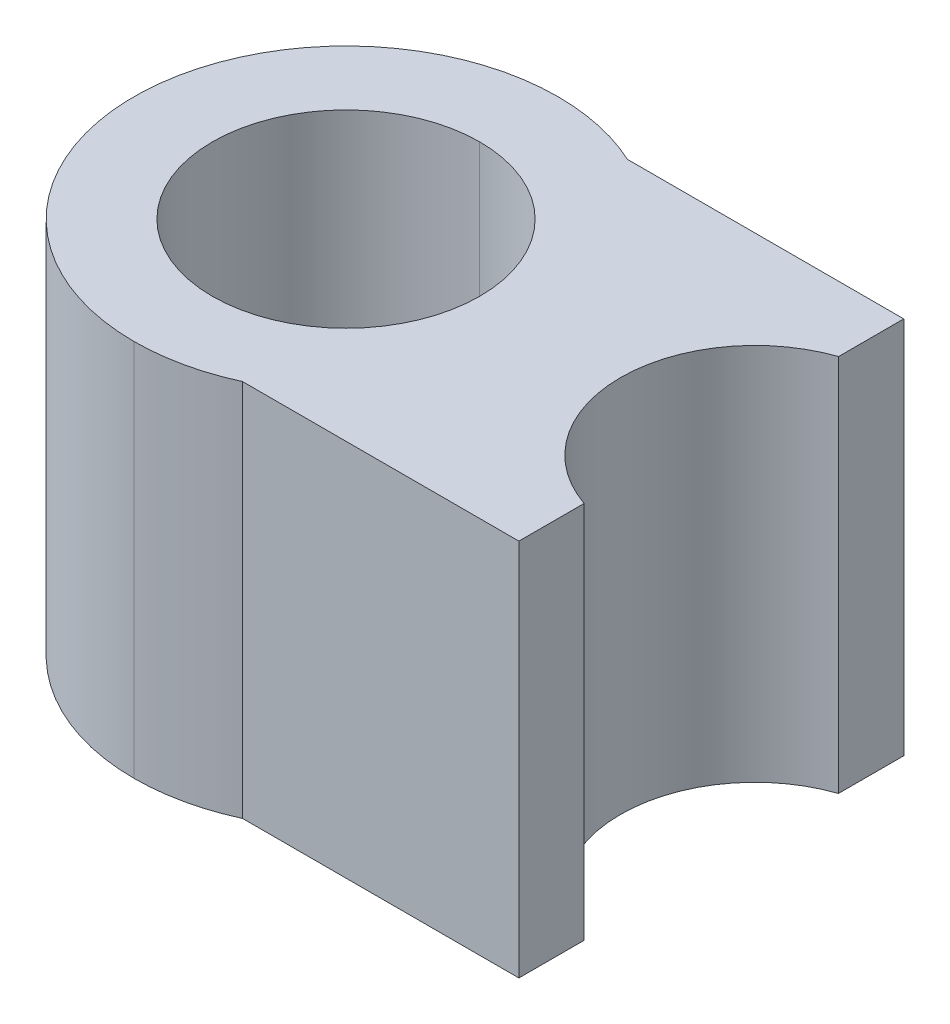
ISO-10303-21;
HEADER;
FILE_DESCRIPTION(('STEP AP214'),'2;1');
FILE_NAME('part.step','',(''),(''),'','','');
FILE_SCHEMA(('AUTOMOTIVE_DESIGN { 1 0 10303 214 1 1 1 1 }'));
ENDSEC;
DATA;
#1=APPLICATION_CONTEXT('core data for automotive mechanical design processes');
#2=APPLICATION_PROTOCOL_DEFINITION('international standard','automotive_design',2000,#1);
#3=PRODUCT_CONTEXT('',#1,'mechanical');
#4=PRODUCT('Part','Part','',(#3));
#5=PRODUCT_RELATED_PRODUCT_CATEGORY('part','',(#4));
#6=PRODUCT_DEFINITION_FORMATION('','',#4);
#7=PRODUCT_DEFINITION_CONTEXT('part definition',#1,'design');
#8=PRODUCT_DEFINITION('design','',#6,#7);
#9=PRODUCT_DEFINITION_SHAPE('','',#8);
#10=(LENGTH_UNIT() NAMED_UNIT(*) SI_UNIT(.MILLI.,.METRE.));
#11=(NAMED_UNIT(*) PLANE_ANGLE_UNIT() SI_UNIT($,.RADIAN.));
#12=(NAMED_UNIT(*) SI_UNIT($,.STERADIAN.) SOLID_ANGLE_UNIT());
#13=UNCERTAINTY_MEASURE_WITH_UNIT(LENGTH_MEASURE(1.E-05),#10,'distance_accuracy_value','');
#14=(GEOMETRIC_REPRESENTATION_CONTEXT(3) GLOBAL_UNCERTAINTY_ASSIGNED_CONTEXT((#13)) GLOBAL_UNIT_ASSIGNED_CONTEXT((#10,
#11,#12)) REPRESENTATION_CONTEXT('',''));
#15=CARTESIAN_POINT('',(0.,0.,0.));
#16=DIRECTION('',(0.,0.,1.));
#17=DIRECTION('',(1.,0.,0.));
#18=AXIS2_PLACEMENT_3D('',#15,#16,#17);
#19=CARTESIAN_POINT('',(-0.56,1.16,0.));
#20=DIRECTION('',(0.,-1.,0.));
#21=DIRECTION('',(0.,0.,-1.));
#22=AXIS2_PLACEMENT_3D('',#19,#20,#21);
#23=CYLINDRICAL_SURFACE('',#22,0.65);
#24=CARTESIAN_POINT('',(-0.56,1.16,0.));
#25=DIRECTION('',(0.,-1.,0.));
#26=DIRECTION('',(0.,0.,-1.));
#27=AXIS2_PLACEMENT_3D('',#24,#25,#26);
#28=CIRCLE('',#27,0.65);
#29=CARTESIAN_POINT('',(-0.28723636606,1.16,0.59));
#30=VERTEX_POINT('',#29);
#31=CARTESIAN_POINT('',(-0.56,1.16,0.65));
#32=VERTEX_POINT('',#31);
#33=EDGE_CURVE('E11',#30,#32,#28,.T.);
#34=ORIENTED_EDGE('',*,*,#33,.T.);
#35=DIRECTION('',(0.,-1.,0.));
#36=VECTOR('',#35,1.);
#37=CARTESIAN_POINT('',(-0.56,1.16,0.65));
#38=LINE('',#37,#36);
#39=CARTESIAN_POINT('',(-0.56,0.,0.65));
#40=VERTEX_POINT('',#39);
#41=EDGE_CURVE('E28',#32,#40,#38,.T.);
#42=ORIENTED_EDGE('',*,*,#41,.T.);
#43=CARTESIAN_POINT('',(-0.56,0.,0.));
#44=DIRECTION('',(0.,1.,0.));
#45=DIRECTION('',(0.,0.,-1.));
#46=AXIS2_PLACEMENT_3D('',#43,#44,#45);
#47=CIRCLE('',#46,0.65);
#48=CARTESIAN_POINT('',(-0.28723636606,0.,0.59));
#49=VERTEX_POINT('',#48);
#50=EDGE_CURVE('E162',#40,#49,#47,.T.);
#51=ORIENTED_EDGE('',*,*,#50,.T.);
#52=DIRECTION('',(0.,1.,0.));
#53=VECTOR('',#52,1.);
#54=CARTESIAN_POINT('',(-0.28723636606,1.16,0.59));
#55=LINE('',#54,#53);
#56=EDGE_CURVE('E202',#49,#30,#55,.T.);
#57=ORIENTED_EDGE('',*,*,#56,.T.);
#58=EDGE_LOOP('',(#34,#42,#51,#57));
#59=FACE_BOUND('',#58,.T.);
#60=ADVANCED_FACE('F17',(#59),#23,.T.);
#61=CARTESIAN_POINT('',(-0.56,1.16,0.));
#62=DIRECTION('',(0.,-1.,0.));
#63=DIRECTION('',(0.,0.,-1.));
#64=AXIS2_PLACEMENT_3D('',#61,#62,#63);
#65=CYLINDRICAL_SURFACE('',#64,0.65);
#66=ORIENTED_EDGE('',*,*,#41,.F.);
#67=CARTESIAN_POINT('',(-0.56,1.16,0.));
#68=DIRECTION('',(0.,-1.,0.));
#69=DIRECTION('',(0.,0.,-1.));
#70=AXIS2_PLACEMENT_3D('',#67,#68,#69);
#71=CIRCLE('',#70,0.65);
#72=CARTESIAN_POINT('',(-0.56,1.16,-0.65));
#73=VERTEX_POINT('',#72);
#74=EDGE_CURVE('E199',#32,#73,#71,.T.);
#75=ORIENTED_EDGE('',*,*,#74,.T.);
#76=DIRECTION('',(0.,-1.,0.));
#77=VECTOR('',#76,1.);
#78=CARTESIAN_POINT('',(-0.56,1.16,-0.65));
#79=LINE('',#78,#77);
#80=CARTESIAN_POINT('',(-0.56,0.,-0.65));
#81=VERTEX_POINT('',#80);
#82=EDGE_CURVE('E203',#73,#81,#79,.T.);
#83=ORIENTED_EDGE('',*,*,#82,.T.);
#84=CARTESIAN_POINT('',(-0.56,0.,0.));
#85=DIRECTION('',(0.,1.,0.));
#86=DIRECTION('',(0.,0.,-1.));
#87=AXIS2_PLACEMENT_3D('',#84,#85,#86);
#88=CIRCLE('',#87,0.65);
#89=EDGE_CURVE('E145',#81,#40,#88,.T.);
#90=ORIENTED_EDGE('',*,*,#89,.T.);
#91=EDGE_LOOP('',(#66,#75,#83,#90));
#92=FACE_BOUND('',#91,.T.);
#93=ADVANCED_FACE('F219',(#92),#65,.T.);
#94=CARTESIAN_POINT('',(-0.56,1.16,0.));
#95=DIRECTION('',(0.,-1.,0.));
#96=DIRECTION('',(0.,0.,-1.));
#97=AXIS2_PLACEMENT_3D('',#94,#95,#96);
#98=CYLINDRICAL_SURFACE('',#97,0.41);
#99=CARTESIAN_POINT('',(-0.56,1.16,0.));
#100=DIRECTION('',(0.,1.,0.));
#101=DIRECTION('',(0.,0.,-1.));
#102=AXIS2_PLACEMENT_3D('',#99,#100,#101);
#103=CIRCLE('',#102,0.41);
#104=CARTESIAN_POINT('',(-0.56,1.16,-0.41));
#105=VERTEX_POINT('',#104);
#106=CARTESIAN_POINT('',(-0.56,1.16,0.41));
#107=VERTEX_POINT('',#106);
#108=EDGE_CURVE('E137',#105,#107,#103,.T.);
#109=ORIENTED_EDGE('',*,*,#108,.T.);
#110=DIRECTION('',(0.,-1.,0.));
#111=VECTOR('',#110,1.);
#112=CARTESIAN_POINT('',(-0.56,1.16,0.41));
#113=LINE('',#112,#111);
#114=CARTESIAN_POINT('',(-0.56,0.,0.41));
#115=VERTEX_POINT('',#114);
#116=EDGE_CURVE('E127',#107,#115,#113,.T.);
#117=ORIENTED_EDGE('',*,*,#116,.T.);
#118=CARTESIAN_POINT('',(-0.56,0.,0.));
#119=DIRECTION('',(0.,1.,0.));
#120=DIRECTION('',(0.,0.,-1.));
#121=AXIS2_PLACEMENT_3D('',#118,#119,#120);
#122=CIRCLE('',#121,0.41);
#123=CARTESIAN_POINT('',(-0.56,0.,-0.41));
#124=VERTEX_POINT('',#123);
#125=EDGE_CURVE('E188',#124,#115,#122,.T.);
#126=ORIENTED_EDGE('',*,*,#125,.F.);
#127=DIRECTION('',(0.,-1.,0.));
#128=VECTOR('',#127,1.);
#129=CARTESIAN_POINT('',(-0.56,1.16,-0.41));
#130=LINE('',#129,#128);
#131=EDGE_CURVE('E142',#105,#124,#130,.T.);
#132=ORIENTED_EDGE('',*,*,#131,.F.);
#133=EDGE_LOOP('',(#109,#117,#126,#132));
#134=FACE_BOUND('',#133,.T.);
#135=ADVANCED_FACE('F141',(#134),#98,.F.);
#136=CARTESIAN_POINT('',(-0.56,1.16,0.));
#137=DIRECTION('',(0.,-1.,0.));
#138=DIRECTION('',(0.,0.,-1.));
#139=AXIS2_PLACEMENT_3D('',#136,#137,#138);
#140=CYLINDRICAL_SURFACE('',#139,0.65);
#141=ORIENTED_EDGE('',*,*,#82,.F.);
#142=CARTESIAN_POINT('',(-0.56,1.16,0.));
#143=DIRECTION('',(0.,-1.,0.));
#144=DIRECTION('',(0.,0.,-1.));
#145=AXIS2_PLACEMENT_3D('',#142,#143,#144);
#146=CIRCLE('',#145,0.65);
#147=CARTESIAN_POINT('',(-0.28723636606,1.16,-0.59));
#148=VERTEX_POINT('',#147);
#149=EDGE_CURVE('E138',#73,#148,#146,.T.);
#150=ORIENTED_EDGE('',*,*,#149,.T.);
#151=DIRECTION('',(0.,-1.,0.));
#152=VECTOR('',#151,1.);
#153=CARTESIAN_POINT('',(-0.28723636606,1.16,-0.59));
#154=LINE('',#153,#152);
#155=CARTESIAN_POINT('',(-0.28723636606,0.,-0.59));
#156=VERTEX_POINT('',#155);
#157=EDGE_CURVE('E204',#148,#156,#154,.T.);
#158=ORIENTED_EDGE('',*,*,#157,.T.);
#159=CARTESIAN_POINT('',(-0.56,0.,0.));
#160=DIRECTION('',(0.,1.,0.));
#161=DIRECTION('',(0.,0.,-1.));
#162=AXIS2_PLACEMENT_3D('',#159,#160,#161);
#163=CIRCLE('',#162,0.65);
#164=EDGE_CURVE('E170',#156,#81,#163,.T.);
#165=ORIENTED_EDGE('',*,*,#164,.T.);
#166=EDGE_LOOP('',(#141,#150,#158,#165));
#167=FACE_BOUND('',#166,.T.);
#168=ADVANCED_FACE('F224',(#167),#140,.T.);
#169=CARTESIAN_POINT('',(0.,0.,0.));
#170=DIRECTION('',(0.,-1.,0.));
#171=DIRECTION('',(0.,0.,-1.));
#172=AXIS2_PLACEMENT_3D('',#169,#170,#171);
#173=PLANE('',#172);
#174=ORIENTED_EDGE('',*,*,#164,.F.);
#175=DIRECTION('',(1.,0.,0.));
#176=VECTOR('',#175,1.);
#177=CARTESIAN_POINT('',(0.,0.,-0.59));
#178=LINE('',#177,#176);
#179=CARTESIAN_POINT('',(0.56,0.,-0.59));
#180=VERTEX_POINT('',#179);
#181=EDGE_CURVE('E166',#156,#180,#178,.T.);
#182=ORIENTED_EDGE('',*,*,#181,.T.);
#183=DIRECTION('',(0.,0.,1.));
#184=VECTOR('',#183,1.);
#185=CARTESIAN_POINT('',(0.56,0.,0.));
#186=LINE('',#185,#184);
#187=CARTESIAN_POINT('',(0.56,0.,-0.390000000001));
#188=VERTEX_POINT('',#187);
#189=EDGE_CURVE('E165',#180,#188,#186,.T.);
#190=ORIENTED_EDGE('',*,*,#189,.T.);
#191=CARTESIAN_POINT('',(0.693899674114,0.,0.));
#192=DIRECTION('',(0.,1.,0.));
#193=DIRECTION('',(0.,0.,-1.));
#194=AXIS2_PLACEMENT_3D('',#191,#192,#193);
#195=CIRCLE('',#194,0.412345877545);
#196=CARTESIAN_POINT('',(0.56,0.,0.39));
#197=VERTEX_POINT('',#196);
#198=EDGE_CURVE('E104',#188,#197,#195,.T.);
#199=ORIENTED_EDGE('',*,*,#198,.T.);
#200=DIRECTION('',(0.,0.,1.));
#201=VECTOR('',#200,1.);
#202=CARTESIAN_POINT('',(0.56,0.,0.));
#203=LINE('',#202,#201);
#204=CARTESIAN_POINT('',(0.56,0.,0.59));
#205=VERTEX_POINT('',#204);
#206=EDGE_CURVE('E116',#197,#205,#203,.T.);
#207=ORIENTED_EDGE('',*,*,#206,.T.);
#208=DIRECTION('',(-1.,0.,0.));
#209=VECTOR('',#208,1.);
#210=CARTESIAN_POINT('',(0.,0.,0.59));
#211=LINE('',#210,#209);
#212=EDGE_CURVE('E21',#205,#49,#211,.T.);
#213=ORIENTED_EDGE('',*,*,#212,.T.);
#214=ORIENTED_EDGE('',*,*,#50,.F.);
#215=ORIENTED_EDGE('',*,*,#89,.F.);
#216=EDGE_LOOP('',(#174,#182,#190,#199,#207,#213,#214,#215));
#217=FACE_BOUND('',#216,.T.);
#218=ORIENTED_EDGE('',*,*,#125,.T.);
#219=CARTESIAN_POINT('',(-0.56,0.,0.));
#220=DIRECTION('',(0.,1.,0.));
#221=DIRECTION('',(0.,0.,-1.));
#222=AXIS2_PLACEMENT_3D('',#219,#220,#221);
#223=CIRCLE('',#222,0.41);
#224=EDGE_CURVE('E133',#115,#124,#223,.T.);
#225=ORIENTED_EDGE('',*,*,#224,.T.);
#226=EDGE_LOOP('',(#218,#225));
#227=FACE_BOUND('',#226,.T.);
#228=ADVANCED_FACE('F227',(#217,#227),#173,.T.);
#229=CARTESIAN_POINT('',(0.,1.16,0.));
#230=DIRECTION('',(0.,-1.,0.));
#231=DIRECTION('',(0.,0.,-1.));
#232=AXIS2_PLACEMENT_3D('',#229,#230,#231);
#233=PLANE('',#232);
#234=DIRECTION('',(0.,0.,1.));
#235=VECTOR('',#234,1.);
#236=CARTESIAN_POINT('',(0.56,1.16,0.));
#237=LINE('',#236,#235);
#238=CARTESIAN_POINT('',(0.56,1.16,-0.59));
#239=VERTEX_POINT('',#238);
#240=CARTESIAN_POINT('',(0.56,1.16,-0.390000000001));
#241=VERTEX_POINT('',#240);
#242=EDGE_CURVE('E156',#239,#241,#237,.T.);
#243=ORIENTED_EDGE('',*,*,#242,.F.);
#244=DIRECTION('',(1.,0.,0.));
#245=VECTOR('',#244,1.);
#246=CARTESIAN_POINT('',(0.,1.16,-0.59));
#247=LINE('',#246,#245);
#248=EDGE_CURVE('E182',#148,#239,#247,.T.);
#249=ORIENTED_EDGE('',*,*,#248,.F.);
#250=ORIENTED_EDGE('',*,*,#149,.F.);
#251=ORIENTED_EDGE('',*,*,#74,.F.);
#252=ORIENTED_EDGE('',*,*,#33,.F.);
#253=DIRECTION('',(-1.,0.,0.));
#254=VECTOR('',#253,1.);
#255=CARTESIAN_POINT('',(0.,1.16,0.59));
#256=LINE('',#255,#254);
#257=CARTESIAN_POINT('',(0.56,1.16,0.59));
#258=VERTEX_POINT('',#257);
#259=EDGE_CURVE('E174',#258,#30,#256,.T.);
#260=ORIENTED_EDGE('',*,*,#259,.F.);
#261=DIRECTION('',(0.,0.,1.));
#262=VECTOR('',#261,1.);
#263=CARTESIAN_POINT('',(0.56,1.16,0.));
#264=LINE('',#263,#262);
#265=CARTESIAN_POINT('',(0.56,1.16,0.39));
#266=VERTEX_POINT('',#265);
#267=EDGE_CURVE('E171',#266,#258,#264,.T.);
#268=ORIENTED_EDGE('',*,*,#267,.F.);
#269=CARTESIAN_POINT('',(0.693899674114,1.16,0.));
#270=DIRECTION('',(0.,1.,0.));
#271=DIRECTION('',(0.,0.,-1.));
#272=AXIS2_PLACEMENT_3D('',#269,#270,#271);
#273=CIRCLE('',#272,0.412345877545);
#274=EDGE_CURVE('E189',#241,#266,#273,.T.);
#275=ORIENTED_EDGE('',*,*,#274,.F.);
#276=EDGE_LOOP('',(#243,#249,#250,#251,#252,#260,#268,#275));
#277=FACE_BOUND('',#276,.T.);
#278=ORIENTED_EDGE('',*,*,#108,.F.);
#279=CARTESIAN_POINT('',(-0.56,1.16,0.));
#280=DIRECTION('',(0.,1.,0.));
#281=DIRECTION('',(0.,0.,-1.));
#282=AXIS2_PLACEMENT_3D('',#279,#280,#281);
#283=CIRCLE('',#282,0.41);
#284=EDGE_CURVE('E131',#107,#105,#283,.T.);
#285=ORIENTED_EDGE('',*,*,#284,.F.);
#286=EDGE_LOOP('',(#278,#285));
#287=FACE_BOUND('',#286,.T.);
#288=ADVANCED_FACE('F147',(#277,#287),#233,.F.);
#289=CARTESIAN_POINT('',(-0.56,1.16,-0.59));
#290=DIRECTION('',(0.,0.,1.));
#291=DIRECTION('',(1.,0.,0.));
#292=AXIS2_PLACEMENT_3D('',#289,#290,#291);
#293=PLANE('',#292);
#294=ORIENTED_EDGE('',*,*,#248,.T.);
#295=DIRECTION('',(0.,1.,0.));
#296=VECTOR('',#295,1.);
#297=CARTESIAN_POINT('',(0.56,1.16,-0.59));
#298=LINE('',#297,#296);
#299=EDGE_CURVE('E195',#180,#239,#298,.T.);
#300=ORIENTED_EDGE('',*,*,#299,.F.);
#301=ORIENTED_EDGE('',*,*,#181,.F.);
#302=ORIENTED_EDGE('',*,*,#157,.F.);
#303=EDGE_LOOP('',(#294,#300,#301,#302));
#304=FACE_BOUND('',#303,.T.);
#305=ADVANCED_FACE('F274',(#304),#293,.F.);
#306=CARTESIAN_POINT('',(-0.56,1.16,0.59));
#307=DIRECTION('',(0.,0.,-1.));
#308=DIRECTION('',(0.,-1.,0.));
#309=AXIS2_PLACEMENT_3D('',#306,#307,#308);
#310=PLANE('',#309);
#311=ORIENTED_EDGE('',*,*,#212,.F.);
#312=DIRECTION('',(0.,-1.,0.));
#313=VECTOR('',#312,1.);
#314=CARTESIAN_POINT('',(0.56,1.16,0.59));
#315=LINE('',#314,#313);
#316=EDGE_CURVE('E175',#258,#205,#315,.T.);
#317=ORIENTED_EDGE('',*,*,#316,.F.);
#318=ORIENTED_EDGE('',*,*,#259,.T.);
#319=ORIENTED_EDGE('',*,*,#56,.F.);
#320=EDGE_LOOP('',(#311,#317,#318,#319));
#321=FACE_BOUND('',#320,.T.);
#322=ADVANCED_FACE('F269',(#321),#310,.F.);
#323=CARTESIAN_POINT('',(0.56,1.16,0.59));
#324=DIRECTION('',(-1.,0.,0.));
#325=DIRECTION('',(0.,0.,1.));
#326=AXIS2_PLACEMENT_3D('',#323,#324,#325);
#327=PLANE('',#326);
#328=ORIENTED_EDGE('',*,*,#267,.T.);
#329=ORIENTED_EDGE('',*,*,#316,.T.);
#330=ORIENTED_EDGE('',*,*,#206,.F.);
#331=DIRECTION('',(0.,-1.,0.));
#332=VECTOR('',#331,1.);
#333=CARTESIAN_POINT('',(0.56,1.16,0.39));
#334=LINE('',#333,#332);
#335=EDGE_CURVE('E192',#266,#197,#334,.T.);
#336=ORIENTED_EDGE('',*,*,#335,.F.);
#337=EDGE_LOOP('',(#328,#329,#330,#336));
#338=FACE_BOUND('',#337,.T.);
#339=ADVANCED_FACE('F273',(#338),#327,.F.);
#340=CARTESIAN_POINT('',(0.693899674114,1.16,0.));
#341=DIRECTION('',(0.,-1.,0.));
#342=DIRECTION('',(0.,0.,-1.));
#343=AXIS2_PLACEMENT_3D('',#340,#341,#342);
#344=CYLINDRICAL_SURFACE('',#343,0.412345877545);
#345=ORIENTED_EDGE('',*,*,#274,.T.);
#346=ORIENTED_EDGE('',*,*,#335,.T.);
#347=ORIENTED_EDGE('',*,*,#198,.F.);
#348=DIRECTION('',(0.,-1.,0.));
#349=VECTOR('',#348,1.);
#350=CARTESIAN_POINT('',(0.56,1.16,-0.390000000001));
#351=LINE('',#350,#349);
#352=EDGE_CURVE('E149',#241,#188,#351,.T.);
#353=ORIENTED_EDGE('',*,*,#352,.F.);
#354=EDGE_LOOP('',(#345,#346,#347,#353));
#355=FACE_BOUND('',#354,.T.);
#356=ADVANCED_FACE('F326',(#355),#344,.F.);
#357=CARTESIAN_POINT('',(0.56,1.16,0.59));
#358=DIRECTION('',(-1.,0.,0.));
#359=DIRECTION('',(0.,0.,1.));
#360=AXIS2_PLACEMENT_3D('',#357,#358,#359);
#361=PLANE('',#360);
#362=ORIENTED_EDGE('',*,*,#189,.F.);
#363=ORIENTED_EDGE('',*,*,#299,.T.);
#364=ORIENTED_EDGE('',*,*,#242,.T.);
#365=ORIENTED_EDGE('',*,*,#352,.T.);
#366=EDGE_LOOP('',(#362,#363,#364,#365));
#367=FACE_BOUND('',#366,.T.);
#368=ADVANCED_FACE('F19',(#367),#361,.F.);
#369=CARTESIAN_POINT('',(-0.56,1.16,0.));
#370=DIRECTION('',(0.,-1.,0.));
#371=DIRECTION('',(0.,0.,-1.));
#372=AXIS2_PLACEMENT_3D('',#369,#370,#371);
#373=CYLINDRICAL_SURFACE('',#372,0.41);
#374=ORIENTED_EDGE('',*,*,#116,.F.);
#375=ORIENTED_EDGE('',*,*,#284,.T.);
#376=ORIENTED_EDGE('',*,*,#131,.T.);
#377=ORIENTED_EDGE('',*,*,#224,.F.);
#378=EDGE_LOOP('',(#374,#375,#376,#377));
#379=FACE_BOUND('',#378,.T.);
#380=ADVANCED_FACE('F129',(#379),#373,.F.);
#381=CLOSED_SHELL('',(#60,#93,#135,#168,#228,#288,#305,#322,#339,#356,#368,#380));
#382=MANIFOLD_SOLID_BREP('B1',#381);
#383=ADVANCED_BREP_SHAPE_REPRESENTATION('',(#18,#382),#14);
#384=SHAPE_DEFINITION_REPRESENTATION(#9,#383);
ENDSEC;
END-ISO-10303-21;
